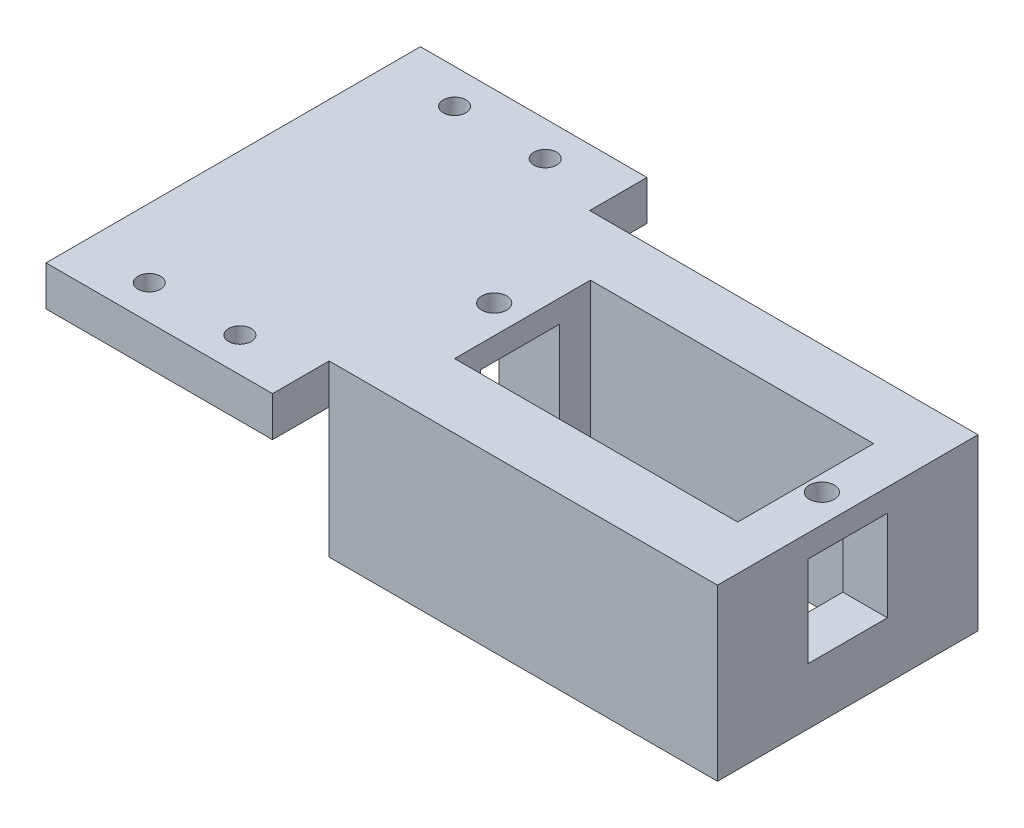
ISO-10303-21;
HEADER;
FILE_DESCRIPTION(('STEP AP214'),'2;1');
FILE_NAME('part.step','',(''),(''),'','','');
FILE_SCHEMA(('AUTOMOTIVE_DESIGN { 1 0 10303 214 1 1 1 1 }'));
ENDSEC;
DATA;
#1=APPLICATION_CONTEXT('core data for automotive mechanical design processes');
#2=APPLICATION_PROTOCOL_DEFINITION('international standard','automotive_design',2000,#1);
#3=PRODUCT_CONTEXT('',#1,'mechanical');
#4=PRODUCT('Part','Part','',(#3));
#5=PRODUCT_RELATED_PRODUCT_CATEGORY('part','',(#4));
#6=PRODUCT_DEFINITION_FORMATION('','',#4);
#7=PRODUCT_DEFINITION_CONTEXT('part definition',#1,'design');
#8=PRODUCT_DEFINITION('design','',#6,#7);
#9=PRODUCT_DEFINITION_SHAPE('','',#8);
#10=(LENGTH_UNIT() NAMED_UNIT(*) SI_UNIT(.MILLI.,.METRE.));
#11=(NAMED_UNIT(*) PLANE_ANGLE_UNIT() SI_UNIT($,.RADIAN.));
#12=(NAMED_UNIT(*) SI_UNIT($,.STERADIAN.) SOLID_ANGLE_UNIT());
#13=UNCERTAINTY_MEASURE_WITH_UNIT(LENGTH_MEASURE(1.E-05),#10,'distance_accuracy_value','');
#14=(GEOMETRIC_REPRESENTATION_CONTEXT(3) GLOBAL_UNCERTAINTY_ASSIGNED_CONTEXT((#13)) GLOBAL_UNIT_ASSIGNED_CONTEXT((#10,
#11,#12)) REPRESENTATION_CONTEXT('',''));
#15=CARTESIAN_POINT('',(0.,0.,0.));
#16=DIRECTION('',(0.,0.,1.));
#17=DIRECTION('',(1.,0.,0.));
#18=AXIS2_PLACEMENT_3D('',#15,#16,#17);
#19=CARTESIAN_POINT('',(0.,0.,0.));
#20=DIRECTION('',(0.,1.,0.));
#21=DIRECTION('',(0.,0.,1.));
#22=AXIS2_PLACEMENT_3D('',#19,#20,#21);
#23=PLANE('',#22);
#24=DIRECTION('',(0.,0.,1.));
#25=VECTOR('',#24,1.);
#26=CARTESIAN_POINT('',(-6.35714285714286,0.,-7.25));
#27=LINE('',#26,#25);
#28=CARTESIAN_POINT('',(-6.35714285714286,0.,-7.25));
#29=VERTEX_POINT('',#28);
#30=CARTESIAN_POINT('',(-6.35714285714286,0.,4.75));
#31=VERTEX_POINT('',#30);
#32=EDGE_CURVE('E303',#29,#31,#27,.T.);
#33=ORIENTED_EDGE('',*,*,#32,.T.);
#34=DIRECTION('',(1.,0.,0.));
#35=VECTOR('',#34,1.);
#36=CARTESIAN_POINT('',(-6.35714285714286,0.,4.75));
#37=LINE('',#36,#35);
#38=CARTESIAN_POINT('',(18.6428571428571,0.,4.75));
#39=VERTEX_POINT('',#38);
#40=EDGE_CURVE('E317',#31,#39,#37,.T.);
#41=ORIENTED_EDGE('',*,*,#40,.T.);
#42=DIRECTION('',(0.,0.,-1.));
#43=VECTOR('',#42,1.);
#44=CARTESIAN_POINT('',(18.6428571428571,0.,-7.25));
#45=LINE('',#44,#43);
#46=CARTESIAN_POINT('',(18.6428571428571,0.,-7.25));
#47=VERTEX_POINT('',#46);
#48=EDGE_CURVE('E320',#39,#47,#45,.T.);
#49=ORIENTED_EDGE('',*,*,#48,.T.);
#50=DIRECTION('',(-1.,0.,0.));
#51=VECTOR('',#50,1.);
#52=CARTESIAN_POINT('',(-6.35714285714286,0.,-7.25));
#53=LINE('',#52,#51);
#54=EDGE_CURVE('E307',#47,#29,#53,.T.);
#55=ORIENTED_EDGE('',*,*,#54,.T.);
#56=EDGE_LOOP('',(#33,#41,#49,#55));
#57=FACE_BOUND('',#56,.T.);
#58=DIRECTION('',(0.,0.,1.));
#59=VECTOR('',#58,1.);
#60=CARTESIAN_POINT('',(-11.7142857142857,0.,-12.5357142857143));
#61=LINE('',#60,#59);
#62=CARTESIAN_POINT('',(-11.7142857142857,0.,-12.5357142857143));
#63=VERTEX_POINT('',#62);
#64=CARTESIAN_POINT('',(-11.7142857142857,0.,10.4642857142857));
#65=VERTEX_POINT('',#64);
#66=EDGE_CURVE('E213',#63,#65,#61,.T.);
#67=ORIENTED_EDGE('',*,*,#66,.F.);
#68=DIRECTION('',(-1.,0.,0.));
#69=VECTOR('',#68,1.);
#70=CARTESIAN_POINT('',(-11.7142857142857,0.,-12.5357142857143));
#71=LINE('',#70,#69);
#72=CARTESIAN_POINT('',(22.5714285714286,0.,-12.5357142857143));
#73=VERTEX_POINT('',#72);
#74=EDGE_CURVE('E337',#73,#63,#71,.T.);
#75=ORIENTED_EDGE('',*,*,#74,.F.);
#76=DIRECTION('',(0.,0.,-1.));
#77=VECTOR('',#76,1.);
#78=CARTESIAN_POINT('',(22.5714285714286,0.,-12.5357142857143));
#79=LINE('',#78,#77);
#80=CARTESIAN_POINT('',(22.5714285714286,0.,10.4642857142857));
#81=VERTEX_POINT('',#80);
#82=EDGE_CURVE('E343',#81,#73,#79,.T.);
#83=ORIENTED_EDGE('',*,*,#82,.F.);
#84=DIRECTION('',(1.,0.,0.));
#85=VECTOR('',#84,1.);
#86=CARTESIAN_POINT('',(-11.7142857142857,0.,10.4642857142857));
#87=LINE('',#86,#85);
#88=EDGE_CURVE('E334',#65,#81,#87,.T.);
#89=ORIENTED_EDGE('',*,*,#88,.F.);
#90=EDGE_LOOP('',(#67,#75,#83,#89));
#91=FACE_BOUND('',#90,.T.);
#92=ADVANCED_FACE('F36',(#57,#91),#23,.F.);
#93=CARTESIAN_POINT('',(-11.7142857142857,15.,10.4642857142857));
#94=DIRECTION('',(0.,0.,-1.));
#95=DIRECTION('',(-1.,0.,0.));
#96=AXIS2_PLACEMENT_3D('',#93,#94,#95);
#97=PLANE('',#96);
#98=DIRECTION('',(0.,1.,0.));
#99=VECTOR('',#98,1.);
#100=CARTESIAN_POINT('',(-11.7142857142857,0.,10.4642857142857));
#101=LINE('',#100,#99);
#102=CARTESIAN_POINT('',(-11.7142857142857,11.4778735674577,10.4642857142857));
#103=VERTEX_POINT('',#102);
#104=EDGE_CURVE('E209',#65,#103,#101,.T.);
#105=ORIENTED_EDGE('',*,*,#104,.F.);
#106=ORIENTED_EDGE('',*,*,#88,.T.);
#107=DIRECTION('',(0.,-1.,0.));
#108=VECTOR('',#107,1.);
#109=CARTESIAN_POINT('',(22.5714285714286,15.,10.4642857142857));
#110=LINE('',#109,#108);
#111=CARTESIAN_POINT('',(22.5714285714286,15.,10.4642857142857));
#112=VERTEX_POINT('',#111);
#113=EDGE_CURVE('E225',#112,#81,#110,.T.);
#114=ORIENTED_EDGE('',*,*,#113,.F.);
#115=DIRECTION('',(1.,0.,0.));
#116=VECTOR('',#115,1.);
#117=CARTESIAN_POINT('',(-11.7142857142857,15.,10.4642857142857));
#118=LINE('',#117,#116);
#119=CARTESIAN_POINT('',(-11.7142857142857,15.,10.4642857142857));
#120=VERTEX_POINT('',#119);
#121=EDGE_CURVE('E220',#120,#112,#118,.T.);
#122=ORIENTED_EDGE('',*,*,#121,.F.);
#123=DIRECTION('',(0.,-1.,0.));
#124=VECTOR('',#123,1.);
#125=CARTESIAN_POINT('',(-11.7142857142857,15.,10.4642857142857));
#126=LINE('',#125,#124);
#127=EDGE_CURVE('E218',#120,#103,#126,.T.);
#128=ORIENTED_EDGE('',*,*,#127,.T.);
#129=EDGE_LOOP('',(#105,#106,#114,#122,#128));
#130=FACE_BOUND('',#129,.T.);
#131=ADVANCED_FACE('F38',(#130),#97,.F.);
#132=CARTESIAN_POINT('',(-11.7142857142857,15.,-12.5357142857143));
#133=DIRECTION('',(0.,0.,1.));
#134=DIRECTION('',(1.,0.,0.));
#135=AXIS2_PLACEMENT_3D('',#132,#133,#134);
#136=PLANE('',#135);
#137=DIRECTION('',(0.,-1.,0.));
#138=VECTOR('',#137,1.);
#139=CARTESIAN_POINT('',(-11.7142857142857,11.4778735674577,-12.5357142857143));
#140=LINE('',#139,#138);
#141=CARTESIAN_POINT('',(-11.7142857142857,11.4778735674577,-12.5357142857143));
#142=VERTEX_POINT('',#141);
#143=EDGE_CURVE('E205',#142,#63,#140,.T.);
#144=ORIENTED_EDGE('',*,*,#143,.F.);
#145=DIRECTION('',(0.,-1.,0.));
#146=VECTOR('',#145,1.);
#147=CARTESIAN_POINT('',(-11.7142857142857,15.,-12.5357142857143));
#148=LINE('',#147,#146);
#149=CARTESIAN_POINT('',(-11.7142857142857,15.,-12.5357142857143));
#150=VERTEX_POINT('',#149);
#151=EDGE_CURVE('E341',#150,#142,#148,.T.);
#152=ORIENTED_EDGE('',*,*,#151,.F.);
#153=DIRECTION('',(-1.,0.,0.));
#154=VECTOR('',#153,1.);
#155=CARTESIAN_POINT('',(-11.7142857142857,15.,-12.5357142857143));
#156=LINE('',#155,#154);
#157=CARTESIAN_POINT('',(22.5714285714286,15.,-12.5357142857143));
#158=VERTEX_POINT('',#157);
#159=EDGE_CURVE('E339',#158,#150,#156,.T.);
#160=ORIENTED_EDGE('',*,*,#159,.F.);
#161=DIRECTION('',(0.,-1.,0.));
#162=VECTOR('',#161,1.);
#163=CARTESIAN_POINT('',(22.5714285714286,15.,-12.5357142857143));
#164=LINE('',#163,#162);
#165=EDGE_CURVE('E349',#158,#73,#164,.T.);
#166=ORIENTED_EDGE('',*,*,#165,.T.);
#167=ORIENTED_EDGE('',*,*,#74,.T.);
#168=EDGE_LOOP('',(#144,#152,#160,#166,#167));
#169=FACE_BOUND('',#168,.T.);
#170=ADVANCED_FACE('F399',(#169),#136,.F.);
#171=CARTESIAN_POINT('',(48.2857142857143,5.,0.));
#172=DIRECTION('',(0.,1.,0.));
#173=DIRECTION('',(0.,0.,1.));
#174=AXIS2_PLACEMENT_3D('',#171,#172,#173);
#175=PLANE('',#174);
#176=DIRECTION('',(-1.,0.,0.));
#177=VECTOR('',#176,1.);
#178=CARTESIAN_POINT('',(48.2857142857143,5.,-4.53571428571429));
#179=LINE('',#178,#177);
#180=CARTESIAN_POINT('',(-6.35714285714286,5.,-4.53571428571429));
#181=VERTEX_POINT('',#180);
#182=CARTESIAN_POINT('',(-11.7142857142857,5.,-4.53571428571429));
#183=VERTEX_POINT('',#182);
#184=EDGE_CURVE('E280',#181,#183,#179,.T.);
#185=ORIENTED_EDGE('',*,*,#184,.T.);
#186=DIRECTION('',(0.,0.,1.));
#187=VECTOR('',#186,1.);
#188=CARTESIAN_POINT('',(-11.7142857142857,5.,0.));
#189=LINE('',#188,#187);
#190=CARTESIAN_POINT('',(-11.7142857142857,5.,2.46428571428571));
#191=VERTEX_POINT('',#190);
#192=EDGE_CURVE('E12',#183,#191,#189,.T.);
#193=ORIENTED_EDGE('',*,*,#192,.T.);
#194=DIRECTION('',(-1.,0.,0.));
#195=VECTOR('',#194,1.);
#196=CARTESIAN_POINT('',(48.2857142857143,5.,2.46428571428571));
#197=LINE('',#196,#195);
#198=CARTESIAN_POINT('',(-6.35714285714286,5.,2.46428571428571));
#199=VERTEX_POINT('',#198);
#200=EDGE_CURVE('E276',#199,#191,#197,.T.);
#201=ORIENTED_EDGE('',*,*,#200,.F.);
#202=DIRECTION('',(0.,0.,1.));
#203=VECTOR('',#202,1.);
#204=CARTESIAN_POINT('',(-6.35714285714286,5.,-7.25));
#205=LINE('',#204,#203);
#206=EDGE_CURVE('E283',#181,#199,#205,.T.);
#207=ORIENTED_EDGE('',*,*,#206,.F.);
#208=EDGE_LOOP('',(#185,#193,#201,#207));
#209=FACE_BOUND('',#208,.T.);
#210=ADVANCED_FACE('F406',(#209),#175,.T.);
#211=CARTESIAN_POINT('',(22.5714285714286,15.,-12.5357142857143));
#212=DIRECTION('',(-1.,0.,0.));
#213=DIRECTION('',(0.,0.,1.));
#214=AXIS2_PLACEMENT_3D('',#211,#212,#213);
#215=PLANE('',#214);
#216=ORIENTED_EDGE('',*,*,#82,.T.);
#217=ORIENTED_EDGE('',*,*,#165,.F.);
#218=DIRECTION('',(0.,0.,-1.));
#219=VECTOR('',#218,1.);
#220=CARTESIAN_POINT('',(22.5714285714286,15.,-12.5357142857143));
#221=LINE('',#220,#219);
#222=EDGE_CURVE('E336',#112,#158,#221,.T.);
#223=ORIENTED_EDGE('',*,*,#222,.F.);
#224=ORIENTED_EDGE('',*,*,#113,.T.);
#225=EDGE_LOOP('',(#216,#217,#223,#224));
#226=FACE_BOUND('',#225,.T.);
#227=DIRECTION('',(0.,1.,0.));
#228=VECTOR('',#227,1.);
#229=CARTESIAN_POINT('',(22.5714285714286,15.,-4.53571428571429));
#230=LINE('',#229,#228);
#231=CARTESIAN_POINT('',(22.5714285714286,5.,-4.53571428571429));
#232=VERTEX_POINT('',#231);
#233=CARTESIAN_POINT('',(22.5714285714286,13.,-4.53571428571429));
#234=VERTEX_POINT('',#233);
#235=EDGE_CURVE('E301',#232,#234,#230,.T.);
#236=ORIENTED_EDGE('',*,*,#235,.F.);
#237=DIRECTION('',(0.,0.,-1.));
#238=VECTOR('',#237,1.);
#239=CARTESIAN_POINT('',(22.5714285714286,5.,-12.5357142857143));
#240=LINE('',#239,#238);
#241=CARTESIAN_POINT('',(22.5714285714286,5.,2.46428571428571));
#242=VERTEX_POINT('',#241);
#243=EDGE_CURVE('E286',#242,#232,#240,.T.);
#244=ORIENTED_EDGE('',*,*,#243,.F.);
#245=DIRECTION('',(0.,-1.,0.));
#246=VECTOR('',#245,1.);
#247=CARTESIAN_POINT('',(22.5714285714286,15.,2.46428571428571));
#248=LINE('',#247,#246);
#249=CARTESIAN_POINT('',(22.5714285714286,13.,2.46428571428571));
#250=VERTEX_POINT('',#249);
#251=EDGE_CURVE('E291',#250,#242,#248,.T.);
#252=ORIENTED_EDGE('',*,*,#251,.F.);
#253=DIRECTION('',(0.,0.,-1.));
#254=VECTOR('',#253,1.);
#255=CARTESIAN_POINT('',(22.5714285714286,13.,-12.5357142857143));
#256=LINE('',#255,#254);
#257=EDGE_CURVE('E295',#250,#234,#256,.T.);
#258=ORIENTED_EDGE('',*,*,#257,.T.);
#259=EDGE_LOOP('',(#236,#244,#252,#258));
#260=FACE_BOUND('',#259,.T.);
#261=ADVANCED_FACE('F408',(#226,#260),#215,.F.);
#262=CARTESIAN_POINT('',(-6.35714285714286,15.,-7.25));
#263=DIRECTION('',(1.,0.,0.));
#264=DIRECTION('',(0.,0.,-1.));
#265=AXIS2_PLACEMENT_3D('',#262,#263,#264);
#266=PLANE('',#265);
#267=ORIENTED_EDGE('',*,*,#32,.F.);
#268=DIRECTION('',(0.,-1.,0.));
#269=VECTOR('',#268,1.);
#270=CARTESIAN_POINT('',(-6.35714285714286,15.,-7.25));
#271=LINE('',#270,#269);
#272=CARTESIAN_POINT('',(-6.35714285714286,15.,-7.25));
#273=VERTEX_POINT('',#272);
#274=EDGE_CURVE('E314',#273,#29,#271,.T.);
#275=ORIENTED_EDGE('',*,*,#274,.F.);
#276=DIRECTION('',(0.,0.,1.));
#277=VECTOR('',#276,1.);
#278=CARTESIAN_POINT('',(-6.35714285714286,15.,-7.25));
#279=LINE('',#278,#277);
#280=CARTESIAN_POINT('',(-6.35714285714286,15.,4.75));
#281=VERTEX_POINT('',#280);
#282=EDGE_CURVE('E304',#273,#281,#279,.T.);
#283=ORIENTED_EDGE('',*,*,#282,.T.);
#284=DIRECTION('',(0.,-1.,0.));
#285=VECTOR('',#284,1.);
#286=CARTESIAN_POINT('',(-6.35714285714286,15.,4.75));
#287=LINE('',#286,#285);
#288=EDGE_CURVE('E331',#281,#31,#287,.T.);
#289=ORIENTED_EDGE('',*,*,#288,.T.);
#290=EDGE_LOOP('',(#267,#275,#283,#289));
#291=FACE_BOUND('',#290,.T.);
#292=DIRECTION('',(0.,0.,1.));
#293=VECTOR('',#292,1.);
#294=CARTESIAN_POINT('',(-6.35714285714286,13.,-7.25));
#295=LINE('',#294,#293);
#296=CARTESIAN_POINT('',(-6.35714285714286,13.,-4.53571428571429));
#297=VERTEX_POINT('',#296);
#298=CARTESIAN_POINT('',(-6.35714285714285,13.,2.46428571428571));
#299=VERTEX_POINT('',#298);
#300=EDGE_CURVE('E293',#297,#299,#295,.T.);
#301=ORIENTED_EDGE('',*,*,#300,.F.);
#302=DIRECTION('',(0.,-1.,0.));
#303=VECTOR('',#302,1.);
#304=CARTESIAN_POINT('',(-6.35714285714286,15.,-4.53571428571429));
#305=LINE('',#304,#303);
#306=EDGE_CURVE('E298',#297,#181,#305,.T.);
#307=ORIENTED_EDGE('',*,*,#306,.T.);
#308=ORIENTED_EDGE('',*,*,#206,.T.);
#309=DIRECTION('',(0.,1.,0.));
#310=VECTOR('',#309,1.);
#311=CARTESIAN_POINT('',(-6.35714285714286,15.,2.46428571428571));
#312=LINE('',#311,#310);
#313=EDGE_CURVE('E288',#199,#299,#312,.T.);
#314=ORIENTED_EDGE('',*,*,#313,.T.);
#315=EDGE_LOOP('',(#301,#307,#308,#314));
#316=FACE_BOUND('',#315,.T.);
#317=ADVANCED_FACE('F410',(#291,#316),#266,.T.);
#318=CARTESIAN_POINT('',(18.6428571428571,15.,-7.25));
#319=DIRECTION('',(-1.,0.,0.));
#320=DIRECTION('',(0.,0.,1.));
#321=AXIS2_PLACEMENT_3D('',#318,#319,#320);
#322=PLANE('',#321);
#323=ORIENTED_EDGE('',*,*,#48,.F.);
#324=DIRECTION('',(0.,-1.,0.));
#325=VECTOR('',#324,1.);
#326=CARTESIAN_POINT('',(18.6428571428571,15.,4.75));
#327=LINE('',#326,#325);
#328=CARTESIAN_POINT('',(18.6428571428571,15.,4.75));
#329=VERTEX_POINT('',#328);
#330=EDGE_CURVE('E329',#329,#39,#327,.T.);
#331=ORIENTED_EDGE('',*,*,#330,.F.);
#332=DIRECTION('',(0.,0.,-1.));
#333=VECTOR('',#332,1.);
#334=CARTESIAN_POINT('',(18.6428571428571,15.,-7.25));
#335=LINE('',#334,#333);
#336=CARTESIAN_POINT('',(18.6428571428571,15.,-7.25));
#337=VERTEX_POINT('',#336);
#338=EDGE_CURVE('E309',#329,#337,#335,.T.);
#339=ORIENTED_EDGE('',*,*,#338,.T.);
#340=DIRECTION('',(0.,-1.,0.));
#341=VECTOR('',#340,1.);
#342=CARTESIAN_POINT('',(18.6428571428571,15.,-7.25));
#343=LINE('',#342,#341);
#344=EDGE_CURVE('E327',#337,#47,#343,.T.);
#345=ORIENTED_EDGE('',*,*,#344,.T.);
#346=EDGE_LOOP('',(#323,#331,#339,#345));
#347=FACE_BOUND('',#346,.T.);
#348=DIRECTION('',(0.,0.,-1.));
#349=VECTOR('',#348,1.);
#350=CARTESIAN_POINT('',(18.6428571428571,5.,-7.25));
#351=LINE('',#350,#349);
#352=CARTESIAN_POINT('',(18.6428571428571,5.,2.46428571428571));
#353=VERTEX_POINT('',#352);
#354=CARTESIAN_POINT('',(18.6428571428571,5.,-4.53571428571429));
#355=VERTEX_POINT('',#354);
#356=EDGE_CURVE('E224',#353,#355,#351,.T.);
#357=ORIENTED_EDGE('',*,*,#356,.T.);
#358=DIRECTION('',(0.,1.,0.));
#359=VECTOR('',#358,1.);
#360=CARTESIAN_POINT('',(18.6428571428571,15.,-4.53571428571429));
#361=LINE('',#360,#359);
#362=CARTESIAN_POINT('',(18.6428571428571,13.,-4.53571428571429));
#363=VERTEX_POINT('',#362);
#364=EDGE_CURVE('E45',#355,#363,#361,.T.);
#365=ORIENTED_EDGE('',*,*,#364,.T.);
#366=DIRECTION('',(0.,0.,-1.));
#367=VECTOR('',#366,1.);
#368=CARTESIAN_POINT('',(18.6428571428571,13.,-7.25));
#369=LINE('',#368,#367);
#370=CARTESIAN_POINT('',(18.6428571428571,13.,2.46428571428571));
#371=VERTEX_POINT('',#370);
#372=EDGE_CURVE('E359',#371,#363,#369,.T.);
#373=ORIENTED_EDGE('',*,*,#372,.F.);
#374=DIRECTION('',(0.,-1.,0.));
#375=VECTOR('',#374,1.);
#376=CARTESIAN_POINT('',(18.6428571428571,15.,2.46428571428571));
#377=LINE('',#376,#375);
#378=EDGE_CURVE('E356',#371,#353,#377,.T.);
#379=ORIENTED_EDGE('',*,*,#378,.T.);
#380=EDGE_LOOP('',(#357,#365,#373,#379));
#381=FACE_BOUND('',#380,.T.);
#382=ADVANCED_FACE('F415',(#347,#381),#322,.T.);
#383=CARTESIAN_POINT('',(0.,15.,0.));
#384=DIRECTION('',(0.,1.,0.));
#385=DIRECTION('',(0.,0.,1.));
#386=AXIS2_PLACEMENT_3D('',#383,#384,#385);
#387=PLANE('',#386);
#388=CARTESIAN_POINT('',(-25.636053252027,15.,12.4237887494161));
#389=DIRECTION('',(0.,1.,0.));
#390=DIRECTION('',(0.,0.,1.));
#391=AXIS2_PLACEMENT_3D('',#388,#389,#390);
#392=CIRCLE('',#391,1.);
#393=CARTESIAN_POINT('',(-25.636053252027,15.,13.4237887494161));
#394=VERTEX_POINT('',#393);
#395=EDGE_CURVE('E495',#394,#394,#392,.T.);
#396=ORIENTED_EDGE('',*,*,#395,.F.);
#397=EDGE_LOOP('',(#396));
#398=FACE_BOUND('',#397,.T.);
#399=CARTESIAN_POINT('',(-17.636053252027,15.,12.4237887494161));
#400=DIRECTION('',(0.,1.,0.));
#401=DIRECTION('',(0.,0.,1.));
#402=AXIS2_PLACEMENT_3D('',#399,#400,#401);
#403=CIRCLE('',#402,0.999999999999998);
#404=CARTESIAN_POINT('',(-17.636053252027,15.,13.4237887494161));
#405=VERTEX_POINT('',#404);
#406=EDGE_CURVE('E497',#405,#405,#403,.T.);
#407=ORIENTED_EDGE('',*,*,#406,.F.);
#408=EDGE_LOOP('',(#407));
#409=FACE_BOUND('',#408,.T.);
#410=CARTESIAN_POINT('',(-17.6456893297298,15.,-14.5418811641384));
#411=DIRECTION('',(0.,1.,0.));
#412=DIRECTION('',(0.,0.,1.));
#413=AXIS2_PLACEMENT_3D('',#410,#411,#412);
#414=CIRCLE('',#413,0.999999999999998);
#415=CARTESIAN_POINT('',(-17.6456893297298,15.,-13.5418811641385));
#416=VERTEX_POINT('',#415);
#417=EDGE_CURVE('E494',#416,#416,#414,.T.);
#418=ORIENTED_EDGE('',*,*,#417,.F.);
#419=EDGE_LOOP('',(#418));
#420=FACE_BOUND('',#419,.T.);
#421=CARTESIAN_POINT('',(-25.6456893297298,15.,-14.5418811641384));
#422=DIRECTION('',(0.,1.,0.));
#423=DIRECTION('',(0.,0.,1.));
#424=AXIS2_PLACEMENT_3D('',#421,#422,#423);
#425=CIRCLE('',#424,1.00000000000001);
#426=CARTESIAN_POINT('',(-25.6456893297298,15.,-13.5418811641384));
#427=VERTEX_POINT('',#426);
#428=EDGE_CURVE('E369',#427,#427,#425,.T.);
#429=ORIENTED_EDGE('',*,*,#428,.F.);
#430=EDGE_LOOP('',(#429));
#431=FACE_BOUND('',#430,.T.);
#432=CARTESIAN_POINT('',(-8.85714285714286,15.,-1.25));
#433=DIRECTION('',(0.,1.,0.));
#434=DIRECTION('',(0.,0.,1.));
#435=AXIS2_PLACEMENT_3D('',#432,#433,#434);
#436=CIRCLE('',#435,1.1);
#437=CARTESIAN_POINT('',(-8.85714285714286,15.,-0.150000000000001));
#438=VERTEX_POINT('',#437);
#439=EDGE_CURVE('E260',#438,#438,#436,.T.);
#440=ORIENTED_EDGE('',*,*,#439,.F.);
#441=EDGE_LOOP('',(#440));
#442=FACE_BOUND('',#441,.T.);
#443=CARTESIAN_POINT('',(20.0714285714286,15.,-1.25));
#444=DIRECTION('',(0.,1.,0.));
#445=DIRECTION('',(0.,0.,1.));
#446=AXIS2_PLACEMENT_3D('',#443,#444,#445);
#447=CIRCLE('',#446,1.1);
#448=CARTESIAN_POINT('',(20.0714285714286,15.,-0.150000000000003));
#449=VERTEX_POINT('',#448);
#450=EDGE_CURVE('E259',#449,#449,#447,.T.);
#451=ORIENTED_EDGE('',*,*,#450,.F.);
#452=EDGE_LOOP('',(#451));
#453=FACE_BOUND('',#452,.T.);
#454=ORIENTED_EDGE('',*,*,#159,.T.);
#455=DIRECTION('',(0.,0.,-1.));
#456=VECTOR('',#455,1.);
#457=CARTESIAN_POINT('',(-11.7142857142857,15.,0.));
#458=LINE('',#457,#456);
#459=CARTESIAN_POINT('',(-11.7142857142857,15.,-17.5952388133896));
#460=VERTEX_POINT('',#459);
#461=EDGE_CURVE('E232',#150,#460,#458,.T.);
#462=ORIENTED_EDGE('',*,*,#461,.T.);
#463=DIRECTION('',(1.,0.,0.));
#464=VECTOR('',#463,1.);
#465=CARTESIAN_POINT('',(-31.7142857142857,15.,-17.5952388133896));
#466=LINE('',#465,#464);
#467=CARTESIAN_POINT('',(-31.7142857142857,15.,-17.5952388133896));
#468=VERTEX_POINT('',#467);
#469=EDGE_CURVE('E252',#468,#460,#466,.T.);
#470=ORIENTED_EDGE('',*,*,#469,.F.);
#471=DIRECTION('',(0.,0.,-1.));
#472=VECTOR('',#471,1.);
#473=CARTESIAN_POINT('',(-31.7142857142857,15.,0.));
#474=LINE('',#473,#472);
#475=CARTESIAN_POINT('',(-31.7142857142857,15.,15.4642857142857));
#476=VERTEX_POINT('',#475);
#477=EDGE_CURVE('E482',#476,#468,#474,.T.);
#478=ORIENTED_EDGE('',*,*,#477,.F.);
#479=DIRECTION('',(1.,0.,0.));
#480=VECTOR('',#479,1.);
#481=CARTESIAN_POINT('',(-31.7142857142857,15.,15.4642857142857));
#482=LINE('',#481,#480);
#483=CARTESIAN_POINT('',(-11.7142857142857,15.,15.4642857142857));
#484=VERTEX_POINT('',#483);
#485=EDGE_CURVE('E255',#476,#484,#482,.T.);
#486=ORIENTED_EDGE('',*,*,#485,.T.);
#487=EDGE_CURVE('E241',#484,#120,#458,.T.);
#488=ORIENTED_EDGE('',*,*,#487,.T.);
#489=ORIENTED_EDGE('',*,*,#121,.T.);
#490=ORIENTED_EDGE('',*,*,#222,.T.);
#491=EDGE_LOOP('',(#454,#462,#470,#478,#486,#488,#489,#490));
#492=FACE_BOUND('',#491,.T.);
#493=DIRECTION('',(1.,0.,0.));
#494=VECTOR('',#493,1.);
#495=CARTESIAN_POINT('',(-6.35714285714286,15.,4.75));
#496=LINE('',#495,#494);
#497=EDGE_CURVE('E306',#281,#329,#496,.T.);
#498=ORIENTED_EDGE('',*,*,#497,.F.);
#499=ORIENTED_EDGE('',*,*,#282,.F.);
#500=DIRECTION('',(-1.,0.,0.));
#501=VECTOR('',#500,1.);
#502=CARTESIAN_POINT('',(-6.35714285714286,15.,-7.25));
#503=LINE('',#502,#501);
#504=EDGE_CURVE('E312',#337,#273,#503,.T.);
#505=ORIENTED_EDGE('',*,*,#504,.F.);
#506=ORIENTED_EDGE('',*,*,#338,.F.);
#507=EDGE_LOOP('',(#498,#499,#505,#506));
#508=FACE_BOUND('',#507,.T.);
#509=ADVANCED_FACE('F403',(#398,#409,#420,#431,#442,#453,#492,#508),#387,.T.);
#510=CARTESIAN_POINT('',(-6.35714285714286,15.,4.75));
#511=DIRECTION('',(0.,0.,-1.));
#512=DIRECTION('',(-1.,0.,0.));
#513=AXIS2_PLACEMENT_3D('',#510,#511,#512);
#514=PLANE('',#513);
#515=ORIENTED_EDGE('',*,*,#40,.F.);
#516=ORIENTED_EDGE('',*,*,#288,.F.);
#517=ORIENTED_EDGE('',*,*,#497,.T.);
#518=ORIENTED_EDGE('',*,*,#330,.T.);
#519=EDGE_LOOP('',(#515,#516,#517,#518));
#520=FACE_BOUND('',#519,.T.);
#521=ADVANCED_FACE('F506',(#520),#514,.T.);
#522=CARTESIAN_POINT('',(-6.35714285714286,15.,-7.25));
#523=DIRECTION('',(0.,0.,1.));
#524=DIRECTION('',(1.,0.,0.));
#525=AXIS2_PLACEMENT_3D('',#522,#523,#524);
#526=PLANE('',#525);
#527=ORIENTED_EDGE('',*,*,#54,.F.);
#528=ORIENTED_EDGE('',*,*,#344,.F.);
#529=ORIENTED_EDGE('',*,*,#504,.T.);
#530=ORIENTED_EDGE('',*,*,#274,.T.);
#531=EDGE_LOOP('',(#527,#528,#529,#530));
#532=FACE_BOUND('',#531,.T.);
#533=ADVANCED_FACE('F451',(#532),#526,.T.);
#534=ORIENTED_EDGE('',*,*,#243,.T.);
#535=EDGE_CURVE('E279',#232,#355,#179,.T.);
#536=ORIENTED_EDGE('',*,*,#535,.T.);
#537=ORIENTED_EDGE('',*,*,#356,.F.);
#538=EDGE_CURVE('E61',#242,#353,#197,.T.);
#539=ORIENTED_EDGE('',*,*,#538,.F.);
#540=EDGE_LOOP('',(#534,#536,#537,#539));
#541=FACE_BOUND('',#540,.T.);
#542=ADVANCED_FACE('F420',(#541),#175,.T.);
#543=CARTESIAN_POINT('',(48.2857142857143,0.,2.46428571428571));
#544=DIRECTION('',(0.,0.,-1.));
#545=DIRECTION('',(0.,1.,0.));
#546=AXIS2_PLACEMENT_3D('',#543,#544,#545);
#547=PLANE('',#546);
#548=ORIENTED_EDGE('',*,*,#251,.T.);
#549=ORIENTED_EDGE('',*,*,#538,.T.);
#550=ORIENTED_EDGE('',*,*,#378,.F.);
#551=DIRECTION('',(-1.,0.,0.));
#552=VECTOR('',#551,1.);
#553=CARTESIAN_POINT('',(48.2857142857143,13.,2.46428571428571));
#554=LINE('',#553,#552);
#555=EDGE_CURVE('E273',#250,#371,#554,.T.);
#556=ORIENTED_EDGE('',*,*,#555,.F.);
#557=EDGE_LOOP('',(#548,#549,#550,#556));
#558=FACE_BOUND('',#557,.T.);
#559=ADVANCED_FACE('F440',(#558),#547,.T.);
#560=CARTESIAN_POINT('',(48.2857142857143,13.,0.));
#561=DIRECTION('',(0.,1.,0.));
#562=DIRECTION('',(0.,0.,1.));
#563=AXIS2_PLACEMENT_3D('',#560,#561,#562);
#564=PLANE('',#563);
#565=CARTESIAN_POINT('',(20.0714285714286,13.,-1.25));
#566=DIRECTION('',(0.,1.,0.));
#567=DIRECTION('',(0.,0.,1.));
#568=AXIS2_PLACEMENT_3D('',#565,#566,#567);
#569=CIRCLE('',#568,1.1);
#570=CARTESIAN_POINT('',(20.0714285714286,13.,-0.150000000000003));
#571=VERTEX_POINT('',#570);
#572=EDGE_CURVE('E268',#571,#571,#569,.T.);
#573=ORIENTED_EDGE('',*,*,#572,.T.);
#574=EDGE_LOOP('',(#573));
#575=FACE_BOUND('',#574,.T.);
#576=ORIENTED_EDGE('',*,*,#555,.T.);
#577=ORIENTED_EDGE('',*,*,#372,.T.);
#578=DIRECTION('',(-1.,0.,0.));
#579=VECTOR('',#578,1.);
#580=CARTESIAN_POINT('',(48.2857142857143,13.,-4.53571428571429));
#581=LINE('',#580,#579);
#582=EDGE_CURVE('E272',#234,#363,#581,.T.);
#583=ORIENTED_EDGE('',*,*,#582,.F.);
#584=ORIENTED_EDGE('',*,*,#257,.F.);
#585=EDGE_LOOP('',(#576,#577,#583,#584));
#586=FACE_BOUND('',#585,.T.);
#587=ADVANCED_FACE('F435',(#575,#586),#564,.F.);
#588=CARTESIAN_POINT('',(48.2857142857143,0.,-4.53571428571429));
#589=DIRECTION('',(0.,0.,1.));
#590=DIRECTION('',(1.,0.,0.));
#591=AXIS2_PLACEMENT_3D('',#588,#589,#590);
#592=PLANE('',#591);
#593=ORIENTED_EDGE('',*,*,#235,.T.);
#594=ORIENTED_EDGE('',*,*,#582,.T.);
#595=ORIENTED_EDGE('',*,*,#364,.F.);
#596=ORIENTED_EDGE('',*,*,#535,.F.);
#597=EDGE_LOOP('',(#593,#594,#595,#596));
#598=FACE_BOUND('',#597,.T.);
#599=ADVANCED_FACE('F431',(#598),#592,.T.);
#600=DIRECTION('',(-1.,0.,0.));
#601=VECTOR('',#600,1.);
#602=CARTESIAN_POINT('',(48.2857142857143,11.4778735674577,-4.53571428571429));
#603=LINE('',#602,#601);
#604=CARTESIAN_POINT('',(-11.7142857142857,11.4778735674577,-4.53571428571429));
#605=VERTEX_POINT('',#604);
#606=CARTESIAN_POINT('',(-31.7142857142857,11.4778735674577,-4.53571428571429));
#607=VERTEX_POINT('',#606);
#608=EDGE_CURVE('E470',#605,#607,#603,.T.);
#609=ORIENTED_EDGE('',*,*,#608,.F.);
#610=DIRECTION('',(0.,-1.,0.));
#611=VECTOR('',#610,1.);
#612=CARTESIAN_POINT('',(-11.7142857142857,0.,-4.53571428571429));
#613=LINE('',#612,#611);
#614=EDGE_CURVE('E230',#605,#183,#613,.T.);
#615=ORIENTED_EDGE('',*,*,#614,.T.);
#616=ORIENTED_EDGE('',*,*,#184,.F.);
#617=ORIENTED_EDGE('',*,*,#306,.F.);
#618=CARTESIAN_POINT('',(-31.7142857142857,13.,-4.53571428571429));
#619=VERTEX_POINT('',#618);
#620=EDGE_CURVE('E269',#297,#619,#581,.T.);
#621=ORIENTED_EDGE('',*,*,#620,.T.);
#622=DIRECTION('',(0.,1.,0.));
#623=VECTOR('',#622,1.);
#624=CARTESIAN_POINT('',(-31.7142857142857,0.,-4.53571428571429));
#625=LINE('',#624,#623);
#626=EDGE_CURVE('E238',#607,#619,#625,.T.);
#627=ORIENTED_EDGE('',*,*,#626,.F.);
#628=EDGE_LOOP('',(#609,#615,#616,#617,#621,#627));
#629=FACE_BOUND('',#628,.T.);
#630=ADVANCED_FACE('F463',(#629),#592,.T.);
#631=CARTESIAN_POINT('',(-8.85714285714286,13.,-1.25));
#632=DIRECTION('',(0.,1.,0.));
#633=DIRECTION('',(0.,0.,1.));
#634=AXIS2_PLACEMENT_3D('',#631,#632,#633);
#635=CIRCLE('',#634,1.1);
#636=CARTESIAN_POINT('',(-8.85714285714286,13.,-0.150000000000001));
#637=VERTEX_POINT('',#636);
#638=EDGE_CURVE('E263',#637,#637,#635,.T.);
#639=ORIENTED_EDGE('',*,*,#638,.T.);
#640=EDGE_LOOP('',(#639));
#641=FACE_BOUND('',#640,.T.);
#642=ORIENTED_EDGE('',*,*,#300,.T.);
#643=CARTESIAN_POINT('',(-31.7142857142857,13.,2.46428571428571));
#644=VERTEX_POINT('',#643);
#645=EDGE_CURVE('E274',#299,#644,#554,.T.);
#646=ORIENTED_EDGE('',*,*,#645,.T.);
#647=DIRECTION('',(0.,0.,1.));
#648=VECTOR('',#647,1.);
#649=CARTESIAN_POINT('',(-31.7142857142857,13.,0.));
#650=LINE('',#649,#648);
#651=EDGE_CURVE('E475',#619,#644,#650,.T.);
#652=ORIENTED_EDGE('',*,*,#651,.F.);
#653=ORIENTED_EDGE('',*,*,#620,.F.);
#654=EDGE_LOOP('',(#642,#646,#652,#653));
#655=FACE_BOUND('',#654,.T.);
#656=ADVANCED_FACE('F450',(#641,#655),#564,.F.);
#657=DIRECTION('',(1.,0.,0.));
#658=VECTOR('',#657,1.);
#659=CARTESIAN_POINT('',(48.2857142857143,11.4778735674577,2.46428571428571));
#660=LINE('',#659,#658);
#661=CARTESIAN_POINT('',(-31.7142857142857,11.4778735674577,2.46428571428571));
#662=VERTEX_POINT('',#661);
#663=CARTESIAN_POINT('',(-11.7142857142857,11.4778735674577,2.46428571428571));
#664=VERTEX_POINT('',#663);
#665=EDGE_CURVE('E202',#662,#664,#660,.T.);
#666=ORIENTED_EDGE('',*,*,#665,.F.);
#667=DIRECTION('',(0.,-1.,0.));
#668=VECTOR('',#667,1.);
#669=CARTESIAN_POINT('',(-31.7142857142857,0.,2.46428571428571));
#670=LINE('',#669,#668);
#671=EDGE_CURVE('E468',#644,#662,#670,.T.);
#672=ORIENTED_EDGE('',*,*,#671,.F.);
#673=ORIENTED_EDGE('',*,*,#645,.F.);
#674=ORIENTED_EDGE('',*,*,#313,.F.);
#675=ORIENTED_EDGE('',*,*,#200,.T.);
#676=DIRECTION('',(0.,1.,0.));
#677=VECTOR('',#676,1.);
#678=CARTESIAN_POINT('',(-11.7142857142857,0.,2.46428571428571));
#679=LINE('',#678,#677);
#680=EDGE_CURVE('E235',#191,#664,#679,.T.);
#681=ORIENTED_EDGE('',*,*,#680,.T.);
#682=EDGE_LOOP('',(#666,#672,#673,#674,#675,#681));
#683=FACE_BOUND('',#682,.T.);
#684=ADVANCED_FACE('F443',(#683),#547,.T.);
#685=CARTESIAN_POINT('',(-8.85714285714286,5.,-1.25));
#686=DIRECTION('',(0.,1.,0.));
#687=DIRECTION('',(0.,0.,1.));
#688=AXIS2_PLACEMENT_3D('',#685,#686,#687);
#689=CYLINDRICAL_SURFACE('',#688,1.1);
#690=ORIENTED_EDGE('',*,*,#439,.T.);
#691=EDGE_LOOP('',(#690));
#692=FACE_BOUND('',#691,.T.);
#693=ORIENTED_EDGE('',*,*,#638,.F.);
#694=EDGE_LOOP('',(#693));
#695=FACE_BOUND('',#694,.T.);
#696=ADVANCED_FACE('F453',(#692,#695),#689,.F.);
#697=CARTESIAN_POINT('',(20.0714285714286,5.,-1.25));
#698=DIRECTION('',(0.,1.,0.));
#699=DIRECTION('',(0.,0.,1.));
#700=AXIS2_PLACEMENT_3D('',#697,#698,#699);
#701=CYLINDRICAL_SURFACE('',#700,1.1);
#702=ORIENTED_EDGE('',*,*,#450,.T.);
#703=EDGE_LOOP('',(#702));
#704=FACE_BOUND('',#703,.T.);
#705=ORIENTED_EDGE('',*,*,#572,.F.);
#706=EDGE_LOOP('',(#705));
#707=FACE_BOUND('',#706,.T.);
#708=ADVANCED_FACE('F460',(#704,#707),#701,.F.);
#709=CARTESIAN_POINT('',(-11.7142857142857,0.,0.));
#710=DIRECTION('',(-1.,0.,0.));
#711=DIRECTION('',(0.,0.,1.));
#712=AXIS2_PLACEMENT_3D('',#709,#710,#711);
#713=PLANE('',#712);
#714=ORIENTED_EDGE('',*,*,#461,.F.);
#715=ORIENTED_EDGE('',*,*,#151,.T.);
#716=DIRECTION('',(0.,0.,-1.));
#717=VECTOR('',#716,1.);
#718=CARTESIAN_POINT('',(-11.7142857142857,11.4778735674577,0.));
#719=LINE('',#718,#717);
#720=CARTESIAN_POINT('',(-11.7142857142857,11.4778735674577,-17.5952388133896));
#721=VERTEX_POINT('',#720);
#722=EDGE_CURVE('E246',#142,#721,#719,.T.);
#723=ORIENTED_EDGE('',*,*,#722,.T.);
#724=DIRECTION('',(0.,1.,0.));
#725=VECTOR('',#724,1.);
#726=CARTESIAN_POINT('',(-11.7142857142857,0.,-17.5952388133896));
#727=LINE('',#726,#725);
#728=EDGE_CURVE('E243',#721,#460,#727,.T.);
#729=ORIENTED_EDGE('',*,*,#728,.T.);
#730=EDGE_LOOP('',(#714,#715,#723,#729));
#731=FACE_BOUND('',#730,.T.);
#732=ADVANCED_FACE('F621',(#731),#713,.F.);
#733=CARTESIAN_POINT('',(-31.7142857142857,11.4778735674577,0.));
#734=DIRECTION('',(0.,1.,0.));
#735=DIRECTION('',(0.,0.,1.));
#736=AXIS2_PLACEMENT_3D('',#733,#734,#735);
#737=PLANE('',#736);
#738=CARTESIAN_POINT('',(-25.636053252027,11.4778735674577,12.4237887494161));
#739=DIRECTION('',(0.,1.,0.));
#740=DIRECTION('',(0.,0.,1.));
#741=AXIS2_PLACEMENT_3D('',#738,#739,#740);
#742=CIRCLE('',#741,1.);
#743=CARTESIAN_POINT('',(-25.636053252027,11.4778735674577,13.4237887494161));
#744=VERTEX_POINT('',#743);
#745=EDGE_CURVE('E40',#744,#744,#742,.T.);
#746=ORIENTED_EDGE('',*,*,#745,.T.);
#747=EDGE_LOOP('',(#746));
#748=FACE_BOUND('',#747,.T.);
#749=CARTESIAN_POINT('',(-17.636053252027,11.4778735674577,12.4237887494161));
#750=DIRECTION('',(0.,1.,0.));
#751=DIRECTION('',(0.,0.,1.));
#752=AXIS2_PLACEMENT_3D('',#749,#750,#751);
#753=CIRCLE('',#752,0.999999999999998);
#754=CARTESIAN_POINT('',(-17.636053252027,11.4778735674577,13.4237887494161));
#755=VERTEX_POINT('',#754);
#756=EDGE_CURVE('E371',#755,#755,#753,.T.);
#757=ORIENTED_EDGE('',*,*,#756,.T.);
#758=EDGE_LOOP('',(#757));
#759=FACE_BOUND('',#758,.T.);
#760=DIRECTION('',(0.,0.,1.));
#761=VECTOR('',#760,1.);
#762=CARTESIAN_POINT('',(-11.7142857142857,11.4778735674577,0.));
#763=LINE('',#762,#761);
#764=CARTESIAN_POINT('',(-11.7142857142857,11.4778735674577,15.4642857142857));
#765=VERTEX_POINT('',#764);
#766=EDGE_CURVE('E199',#103,#765,#763,.T.);
#767=ORIENTED_EDGE('',*,*,#766,.T.);
#768=DIRECTION('',(1.,0.,0.));
#769=VECTOR('',#768,1.);
#770=CARTESIAN_POINT('',(-31.7142857142857,11.4778735674577,15.4642857142857));
#771=LINE('',#770,#769);
#772=CARTESIAN_POINT('',(-31.7142857142857,11.4778735674577,15.4642857142857));
#773=VERTEX_POINT('',#772);
#774=EDGE_CURVE('E257',#773,#765,#771,.T.);
#775=ORIENTED_EDGE('',*,*,#774,.F.);
#776=DIRECTION('',(0.,0.,1.));
#777=VECTOR('',#776,1.);
#778=CARTESIAN_POINT('',(-31.7142857142857,11.4778735674577,0.));
#779=LINE('',#778,#777);
#780=EDGE_CURVE('E249',#662,#773,#779,.T.);
#781=ORIENTED_EDGE('',*,*,#780,.F.);
#782=ORIENTED_EDGE('',*,*,#665,.T.);
#783=DIRECTION('',(0.,0.,-1.));
#784=VECTOR('',#783,1.);
#785=CARTESIAN_POINT('',(-11.7142857142857,11.4778735674577,10.4642857142857));
#786=LINE('',#785,#784);
#787=EDGE_CURVE('E194',#103,#664,#786,.T.);
#788=ORIENTED_EDGE('',*,*,#787,.F.);
#789=EDGE_LOOP('',(#767,#775,#781,#782,#788));
#790=FACE_BOUND('',#789,.T.);
#791=ADVANCED_FACE('F196',(#748,#759,#790),#737,.F.);
#792=CARTESIAN_POINT('',(-31.7142857142857,0.,15.4642857142857));
#793=DIRECTION('',(0.,0.,1.));
#794=DIRECTION('',(1.,0.,0.));
#795=AXIS2_PLACEMENT_3D('',#792,#793,#794);
#796=PLANE('',#795);
#797=DIRECTION('',(0.,-1.,0.));
#798=VECTOR('',#797,1.);
#799=CARTESIAN_POINT('',(-11.7142857142857,0.,15.4642857142857));
#800=LINE('',#799,#798);
#801=EDGE_CURVE('E229',#484,#765,#800,.T.);
#802=ORIENTED_EDGE('',*,*,#801,.F.);
#803=ORIENTED_EDGE('',*,*,#485,.F.);
#804=DIRECTION('',(0.,-1.,0.));
#805=VECTOR('',#804,1.);
#806=CARTESIAN_POINT('',(-31.7142857142857,0.,15.4642857142857));
#807=LINE('',#806,#805);
#808=EDGE_CURVE('E484',#476,#773,#807,.T.);
#809=ORIENTED_EDGE('',*,*,#808,.T.);
#810=ORIENTED_EDGE('',*,*,#774,.T.);
#811=EDGE_LOOP('',(#802,#803,#809,#810));
#812=FACE_BOUND('',#811,.T.);
#813=ADVANCED_FACE('F656',(#812),#796,.T.);
#814=CARTESIAN_POINT('',(-31.7142857142857,0.,-17.5952388133896));
#815=DIRECTION('',(0.,0.,-1.));
#816=DIRECTION('',(-1.,0.,0.));
#817=AXIS2_PLACEMENT_3D('',#814,#815,#816);
#818=PLANE('',#817);
#819=ORIENTED_EDGE('',*,*,#728,.F.);
#820=DIRECTION('',(1.,0.,0.));
#821=VECTOR('',#820,1.);
#822=CARTESIAN_POINT('',(-31.7142857142857,11.4778735674577,-17.5952388133896));
#823=LINE('',#822,#821);
#824=CARTESIAN_POINT('',(-31.7142857142857,11.4778735674577,-17.5952388133896));
#825=VERTEX_POINT('',#824);
#826=EDGE_CURVE('E250',#825,#721,#823,.T.);
#827=ORIENTED_EDGE('',*,*,#826,.F.);
#828=DIRECTION('',(0.,1.,0.));
#829=VECTOR('',#828,1.);
#830=CARTESIAN_POINT('',(-31.7142857142857,0.,-17.5952388133896));
#831=LINE('',#830,#829);
#832=EDGE_CURVE('E479',#825,#468,#831,.T.);
#833=ORIENTED_EDGE('',*,*,#832,.T.);
#834=ORIENTED_EDGE('',*,*,#469,.T.);
#835=EDGE_LOOP('',(#819,#827,#833,#834));
#836=FACE_BOUND('',#835,.T.);
#837=ADVANCED_FACE('F669',(#836),#818,.T.);
#838=CARTESIAN_POINT('',(-31.7142857142857,11.4778735674577,0.));
#839=DIRECTION('',(0.,-1.,0.));
#840=DIRECTION('',(0.,0.,-1.));
#841=AXIS2_PLACEMENT_3D('',#838,#839,#840);
#842=PLANE('',#841);
#843=CARTESIAN_POINT('',(-17.6456893297298,11.4778735674577,-14.5418811641384));
#844=DIRECTION('',(0.,-1.,0.));
#845=DIRECTION('',(0.,0.,-1.));
#846=AXIS2_PLACEMENT_3D('',#843,#844,#845);
#847=CIRCLE('',#846,0.999999999999998);
#848=CARTESIAN_POINT('',(-17.6456893297298,11.4778735674577,-15.5418811641384));
#849=VERTEX_POINT('',#848);
#850=EDGE_CURVE('E368',#849,#849,#847,.T.);
#851=ORIENTED_EDGE('',*,*,#850,.F.);
#852=EDGE_LOOP('',(#851));
#853=FACE_BOUND('',#852,.T.);
#854=CARTESIAN_POINT('',(-25.6456893297298,11.4778735674577,-14.5418811641384));
#855=DIRECTION('',(0.,-1.,0.));
#856=DIRECTION('',(0.,0.,-1.));
#857=AXIS2_PLACEMENT_3D('',#854,#855,#856);
#858=CIRCLE('',#857,1.00000000000001);
#859=CARTESIAN_POINT('',(-25.6456893297298,11.4778735674577,-15.5418811641385));
#860=VERTEX_POINT('',#859);
#861=EDGE_CURVE('E365',#860,#860,#858,.T.);
#862=ORIENTED_EDGE('',*,*,#861,.F.);
#863=EDGE_LOOP('',(#862));
#864=FACE_BOUND('',#863,.T.);
#865=ORIENTED_EDGE('',*,*,#722,.F.);
#866=EDGE_CURVE('E206',#605,#142,#786,.T.);
#867=ORIENTED_EDGE('',*,*,#866,.F.);
#868=ORIENTED_EDGE('',*,*,#608,.T.);
#869=DIRECTION('',(0.,0.,-1.));
#870=VECTOR('',#869,1.);
#871=CARTESIAN_POINT('',(-31.7142857142857,11.4778735674577,0.));
#872=LINE('',#871,#870);
#873=EDGE_CURVE('E53',#607,#825,#872,.T.);
#874=ORIENTED_EDGE('',*,*,#873,.T.);
#875=ORIENTED_EDGE('',*,*,#826,.T.);
#876=EDGE_LOOP('',(#865,#867,#868,#874,#875));
#877=FACE_BOUND('',#876,.T.);
#878=ADVANCED_FACE('F665',(#853,#864,#877),#842,.T.);
#879=CARTESIAN_POINT('',(-31.7142857142857,0.,0.));
#880=DIRECTION('',(-1.,0.,0.));
#881=DIRECTION('',(0.,0.,1.));
#882=AXIS2_PLACEMENT_3D('',#879,#880,#881);
#883=PLANE('',#882);
#884=ORIENTED_EDGE('',*,*,#671,.T.);
#885=ORIENTED_EDGE('',*,*,#780,.T.);
#886=ORIENTED_EDGE('',*,*,#808,.F.);
#887=ORIENTED_EDGE('',*,*,#477,.T.);
#888=ORIENTED_EDGE('',*,*,#832,.F.);
#889=ORIENTED_EDGE('',*,*,#873,.F.);
#890=ORIENTED_EDGE('',*,*,#626,.T.);
#891=ORIENTED_EDGE('',*,*,#651,.T.);
#892=EDGE_LOOP('',(#884,#885,#886,#887,#888,#889,#890,#891));
#893=FACE_BOUND('',#892,.T.);
#894=ADVANCED_FACE('F472',(#893),#883,.T.);
#895=ORIENTED_EDGE('',*,*,#127,.F.);
#896=ORIENTED_EDGE('',*,*,#487,.F.);
#897=ORIENTED_EDGE('',*,*,#801,.T.);
#898=ORIENTED_EDGE('',*,*,#766,.F.);
#899=EDGE_LOOP('',(#895,#896,#897,#898));
#900=FACE_BOUND('',#899,.T.);
#901=ADVANCED_FACE('F227',(#900),#713,.F.);
#902=CARTESIAN_POINT('',(-11.7142857142857,0.,0.));
#903=DIRECTION('',(-1.,0.,0.));
#904=DIRECTION('',(0.,0.,1.));
#905=AXIS2_PLACEMENT_3D('',#902,#903,#904);
#906=PLANE('',#905);
#907=ORIENTED_EDGE('',*,*,#866,.T.);
#908=ORIENTED_EDGE('',*,*,#143,.T.);
#909=ORIENTED_EDGE('',*,*,#66,.T.);
#910=ORIENTED_EDGE('',*,*,#104,.T.);
#911=ORIENTED_EDGE('',*,*,#787,.T.);
#912=ORIENTED_EDGE('',*,*,#680,.F.);
#913=ORIENTED_EDGE('',*,*,#192,.F.);
#914=ORIENTED_EDGE('',*,*,#614,.F.);
#915=EDGE_LOOP('',(#907,#908,#909,#910,#911,#912,#913,#914));
#916=FACE_BOUND('',#915,.T.);
#917=ADVANCED_FACE('F211',(#916),#906,.T.);
#918=CARTESIAN_POINT('',(-25.6456893297298,-5.,-14.5418811641384));
#919=DIRECTION('',(0.,1.,0.));
#920=DIRECTION('',(0.,0.,1.));
#921=AXIS2_PLACEMENT_3D('',#918,#919,#920);
#922=CYLINDRICAL_SURFACE('',#921,1.00000000000001);
#923=ORIENTED_EDGE('',*,*,#861,.T.);
#924=EDGE_LOOP('',(#923));
#925=FACE_BOUND('',#924,.T.);
#926=ORIENTED_EDGE('',*,*,#428,.T.);
#927=EDGE_LOOP('',(#926));
#928=FACE_BOUND('',#927,.T.);
#929=ADVANCED_FACE('F678',(#925,#928),#922,.F.);
#930=CARTESIAN_POINT('',(-17.6456893297298,-5.,-14.5418811641384));
#931=DIRECTION('',(0.,1.,0.));
#932=DIRECTION('',(0.,0.,1.));
#933=AXIS2_PLACEMENT_3D('',#930,#931,#932);
#934=CYLINDRICAL_SURFACE('',#933,0.999999999999998);
#935=ORIENTED_EDGE('',*,*,#850,.T.);
#936=EDGE_LOOP('',(#935));
#937=FACE_BOUND('',#936,.T.);
#938=ORIENTED_EDGE('',*,*,#417,.T.);
#939=EDGE_LOOP('',(#938));
#940=FACE_BOUND('',#939,.T.);
#941=ADVANCED_FACE('F387',(#937,#940),#934,.F.);
#942=CARTESIAN_POINT('',(-17.636053252027,-5.,12.4237887494161));
#943=DIRECTION('',(0.,1.,0.));
#944=DIRECTION('',(0.,0.,1.));
#945=AXIS2_PLACEMENT_3D('',#942,#943,#944);
#946=CYLINDRICAL_SURFACE('',#945,0.999999999999998);
#947=ORIENTED_EDGE('',*,*,#406,.T.);
#948=EDGE_LOOP('',(#947));
#949=FACE_BOUND('',#948,.T.);
#950=ORIENTED_EDGE('',*,*,#756,.F.);
#951=EDGE_LOOP('',(#950));
#952=FACE_BOUND('',#951,.T.);
#953=ADVANCED_FACE('F381',(#949,#952),#946,.F.);
#954=CARTESIAN_POINT('',(-25.636053252027,-5.,12.4237887494161));
#955=DIRECTION('',(0.,1.,0.));
#956=DIRECTION('',(0.,0.,1.));
#957=AXIS2_PLACEMENT_3D('',#954,#955,#956);
#958=CYLINDRICAL_SURFACE('',#957,1.);
#959=ORIENTED_EDGE('',*,*,#395,.T.);
#960=EDGE_LOOP('',(#959));
#961=FACE_BOUND('',#960,.T.);
#962=ORIENTED_EDGE('',*,*,#745,.F.);
#963=EDGE_LOOP('',(#962));
#964=FACE_BOUND('',#963,.T.);
#965=ADVANCED_FACE('F379',(#961,#964),#958,.F.);
#966=CLOSED_SHELL('',(#92,#131,#170,#210,#261,#317,#382,#509,#521,#533,#542,#559,#587,#599,#630,
#656,#684,#696,#708,#732,#791,#813,#837,#878,#894,#901,#917,#929,#941,#953,#965));
#967=MANIFOLD_SOLID_BREP('B2',#966);
#968=ADVANCED_BREP_SHAPE_REPRESENTATION('',(#18,#967),#14);
#969=SHAPE_DEFINITION_REPRESENTATION(#9,#968);
ENDSEC;
END-ISO-10303-21;
